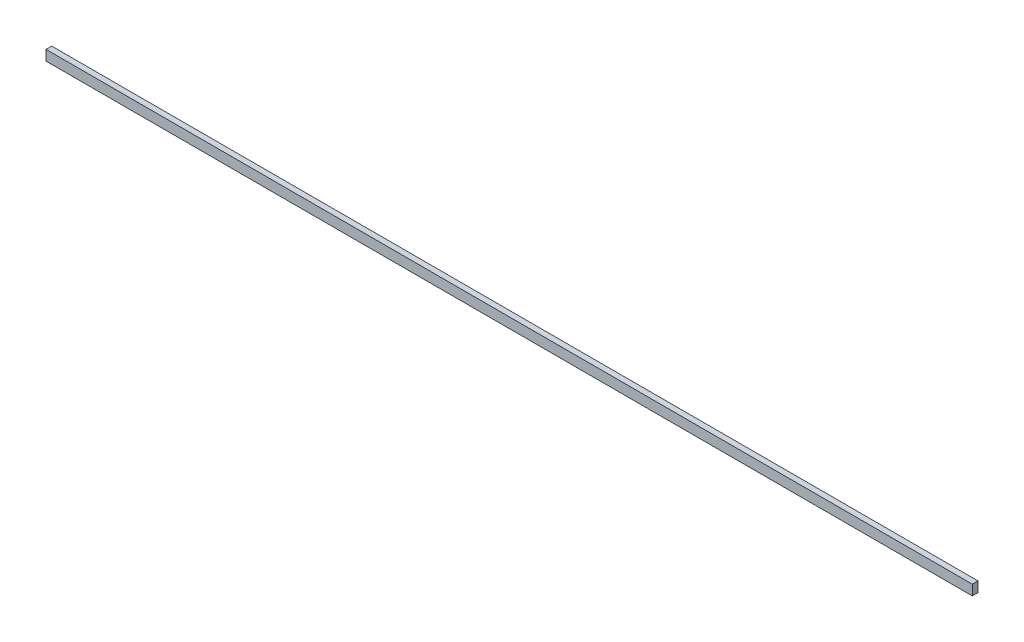
ISO-10303-21;
HEADER;
FILE_DESCRIPTION(('STEP AP214'),'2;1');
FILE_NAME('part.step','',(''),(''),'','','');
FILE_SCHEMA(('AUTOMOTIVE_DESIGN { 1 0 10303 214 1 1 1 1 }'));
ENDSEC;
DATA;
#1=APPLICATION_CONTEXT('core data for automotive mechanical design processes');
#2=APPLICATION_PROTOCOL_DEFINITION('international standard','automotive_design',2000,#1);
#3=PRODUCT_CONTEXT('',#1,'mechanical');
#4=PRODUCT('Part','Part','',(#3));
#5=PRODUCT_RELATED_PRODUCT_CATEGORY('part','',(#4));
#6=PRODUCT_DEFINITION_FORMATION('','',#4);
#7=PRODUCT_DEFINITION_CONTEXT('part definition',#1,'design');
#8=PRODUCT_DEFINITION('design','',#6,#7);
#9=PRODUCT_DEFINITION_SHAPE('','',#8);
#10=(LENGTH_UNIT() NAMED_UNIT(*) SI_UNIT(.MILLI.,.METRE.));
#11=(NAMED_UNIT(*) PLANE_ANGLE_UNIT() SI_UNIT($,.RADIAN.));
#12=(NAMED_UNIT(*) SI_UNIT($,.STERADIAN.) SOLID_ANGLE_UNIT());
#13=UNCERTAINTY_MEASURE_WITH_UNIT(LENGTH_MEASURE(1.E-05),#10,'distance_accuracy_value','');
#14=(GEOMETRIC_REPRESENTATION_CONTEXT(3) GLOBAL_UNCERTAINTY_ASSIGNED_CONTEXT((#13)) GLOBAL_UNIT_ASSIGNED_CONTEXT((#10,
#11,#12)) REPRESENTATION_CONTEXT('',''));
#15=CARTESIAN_POINT('',(0.,0.,0.));
#16=DIRECTION('',(0.,0.,1.));
#17=DIRECTION('',(1.,0.,0.));
#18=AXIS2_PLACEMENT_3D('',#15,#16,#17);
#19=CARTESIAN_POINT('',(227.8,-2.50000000000008,1.4));
#20=DIRECTION('',(-1.,0.,0.));
#21=DIRECTION('',(0.,0.,1.));
#22=AXIS2_PLACEMENT_3D('',#19,#20,#21);
#23=PLANE('',#22);
#24=DIRECTION('',(0.,1.,0.));
#25=VECTOR('',#24,1.);
#26=CARTESIAN_POINT('',(227.8,-2.50000000000008,-1.4));
#27=LINE('',#26,#25);
#28=CARTESIAN_POINT('',(227.8,-2.50000000000008,-1.4));
#29=VERTEX_POINT('',#28);
#30=CARTESIAN_POINT('',(227.8,2.50000000000008,-1.4));
#31=VERTEX_POINT('',#30);
#32=EDGE_CURVE('E96',#29,#31,#27,.T.);
#33=ORIENTED_EDGE('',*,*,#32,.T.);
#34=DIRECTION('',(0.,0.,-1.));
#35=VECTOR('',#34,1.);
#36=CARTESIAN_POINT('',(227.8,2.50000000000008,1.4));
#37=LINE('',#36,#35);
#38=CARTESIAN_POINT('',(227.8,2.50000000000008,1.4));
#39=VERTEX_POINT('',#38);
#40=EDGE_CURVE('E11',#39,#31,#37,.T.);
#41=ORIENTED_EDGE('',*,*,#40,.F.);
#42=DIRECTION('',(0.,1.,0.));
#43=VECTOR('',#42,1.);
#44=CARTESIAN_POINT('',(227.8,-2.50000000000008,1.4));
#45=LINE('',#44,#43);
#46=CARTESIAN_POINT('',(227.8,-2.50000000000008,1.4));
#47=VERTEX_POINT('',#46);
#48=EDGE_CURVE('E84',#47,#39,#45,.T.);
#49=ORIENTED_EDGE('',*,*,#48,.F.);
#50=DIRECTION('',(0.,0.,-1.));
#51=VECTOR('',#50,1.);
#52=CARTESIAN_POINT('',(227.8,-2.50000000000008,1.4));
#53=LINE('',#52,#51);
#54=EDGE_CURVE('E92',#47,#29,#53,.T.);
#55=ORIENTED_EDGE('',*,*,#54,.T.);
#56=EDGE_LOOP('',(#33,#41,#49,#55));
#57=FACE_BOUND('',#56,.T.);
#58=ADVANCED_FACE('F33',(#57),#23,.F.);
#59=CARTESIAN_POINT('',(-227.8,2.49999999999992,1.4));
#60=DIRECTION('',(0.,-1.,0.));
#61=DIRECTION('',(1.,0.,0.));
#62=AXIS2_PLACEMENT_3D('',#59,#60,#61);
#63=PLANE('',#62);
#64=DIRECTION('',(-1.,0.,0.));
#65=VECTOR('',#64,1.);
#66=CARTESIAN_POINT('',(-227.8,2.49999999999992,-1.4));
#67=LINE('',#66,#65);
#68=CARTESIAN_POINT('',(-227.8,2.49999999999992,-1.4));
#69=VERTEX_POINT('',#68);
#70=EDGE_CURVE('E88',#31,#69,#67,.T.);
#71=ORIENTED_EDGE('',*,*,#70,.T.);
#72=DIRECTION('',(0.,0.,-1.));
#73=VECTOR('',#72,1.);
#74=CARTESIAN_POINT('',(-227.8,2.49999999999992,1.4));
#75=LINE('',#74,#73);
#76=CARTESIAN_POINT('',(-227.8,2.49999999999992,1.4));
#77=VERTEX_POINT('',#76);
#78=EDGE_CURVE('E41',#77,#69,#75,.T.);
#79=ORIENTED_EDGE('',*,*,#78,.F.);
#80=DIRECTION('',(-1.,0.,0.));
#81=VECTOR('',#80,1.);
#82=CARTESIAN_POINT('',(-227.8,2.49999999999992,1.4));
#83=LINE('',#82,#81);
#84=EDGE_CURVE('E79',#39,#77,#83,.T.);
#85=ORIENTED_EDGE('',*,*,#84,.F.);
#86=ORIENTED_EDGE('',*,*,#40,.T.);
#87=EDGE_LOOP('',(#71,#79,#85,#86));
#88=FACE_BOUND('',#87,.T.);
#89=ADVANCED_FACE('F87',(#88),#63,.F.);
#90=CARTESIAN_POINT('',(-227.8,-2.50000000000008,1.4));
#91=DIRECTION('',(1.,0.,0.));
#92=DIRECTION('',(0.,0.,-1.));
#93=AXIS2_PLACEMENT_3D('',#90,#91,#92);
#94=PLANE('',#93);
#95=DIRECTION('',(0.,-1.,0.));
#96=VECTOR('',#95,1.);
#97=CARTESIAN_POINT('',(-227.8,-2.50000000000008,-1.4));
#98=LINE('',#97,#96);
#99=CARTESIAN_POINT('',(-227.8,-2.50000000000008,-1.4));
#100=VERTEX_POINT('',#99);
#101=EDGE_CURVE('E66',#69,#100,#98,.T.);
#102=ORIENTED_EDGE('',*,*,#101,.T.);
#103=DIRECTION('',(0.,0.,-1.));
#104=VECTOR('',#103,1.);
#105=CARTESIAN_POINT('',(-227.8,-2.50000000000008,1.4));
#106=LINE('',#105,#104);
#107=CARTESIAN_POINT('',(-227.8,-2.50000000000008,1.4));
#108=VERTEX_POINT('',#107);
#109=EDGE_CURVE('E89',#108,#100,#106,.T.);
#110=ORIENTED_EDGE('',*,*,#109,.F.);
#111=DIRECTION('',(0.,-1.,0.));
#112=VECTOR('',#111,1.);
#113=CARTESIAN_POINT('',(-227.8,-2.50000000000008,1.4));
#114=LINE('',#113,#112);
#115=EDGE_CURVE('E82',#77,#108,#114,.T.);
#116=ORIENTED_EDGE('',*,*,#115,.F.);
#117=ORIENTED_EDGE('',*,*,#78,.T.);
#118=EDGE_LOOP('',(#102,#110,#116,#117));
#119=FACE_BOUND('',#118,.T.);
#120=ADVANCED_FACE('F90',(#119),#94,.F.);
#121=CARTESIAN_POINT('',(-227.8,-2.50000000000008,1.4));
#122=DIRECTION('',(0.,1.,0.));
#123=DIRECTION('',(0.,0.,1.));
#124=AXIS2_PLACEMENT_3D('',#121,#122,#123);
#125=PLANE('',#124);
#126=DIRECTION('',(1.,0.,0.));
#127=VECTOR('',#126,1.);
#128=CARTESIAN_POINT('',(-227.8,-2.50000000000008,-1.4));
#129=LINE('',#128,#127);
#130=EDGE_CURVE('E72',#100,#29,#129,.T.);
#131=ORIENTED_EDGE('',*,*,#130,.T.);
#132=ORIENTED_EDGE('',*,*,#54,.F.);
#133=DIRECTION('',(1.,0.,0.));
#134=VECTOR('',#133,1.);
#135=CARTESIAN_POINT('',(-227.8,-2.50000000000008,1.4));
#136=LINE('',#135,#134);
#137=EDGE_CURVE('E49',#108,#47,#136,.T.);
#138=ORIENTED_EDGE('',*,*,#137,.F.);
#139=ORIENTED_EDGE('',*,*,#109,.T.);
#140=EDGE_LOOP('',(#131,#132,#138,#139));
#141=FACE_BOUND('',#140,.T.);
#142=ADVANCED_FACE('F103',(#141),#125,.F.);
#143=CARTESIAN_POINT('',(0.,0.,1.4));
#144=DIRECTION('',(0.,0.,-1.));
#145=DIRECTION('',(-1.,0.,0.));
#146=AXIS2_PLACEMENT_3D('',#143,#144,#145);
#147=PLANE('',#146);
#148=ORIENTED_EDGE('',*,*,#48,.T.);
#149=ORIENTED_EDGE('',*,*,#84,.T.);
#150=ORIENTED_EDGE('',*,*,#115,.T.);
#151=ORIENTED_EDGE('',*,*,#137,.T.);
#152=EDGE_LOOP('',(#148,#149,#150,#151));
#153=FACE_BOUND('',#152,.T.);
#154=ADVANCED_FACE('F80',(#153),#147,.F.);
#155=CARTESIAN_POINT('',(0.,0.,-1.4));
#156=DIRECTION('',(0.,0.,-1.));
#157=DIRECTION('',(-1.,0.,0.));
#158=AXIS2_PLACEMENT_3D('',#155,#156,#157);
#159=PLANE('',#158);
#160=ORIENTED_EDGE('',*,*,#32,.F.);
#161=ORIENTED_EDGE('',*,*,#130,.F.);
#162=ORIENTED_EDGE('',*,*,#101,.F.);
#163=ORIENTED_EDGE('',*,*,#70,.F.);
#164=EDGE_LOOP('',(#160,#161,#162,#163));
#165=FACE_BOUND('',#164,.T.);
#166=ADVANCED_FACE('F106',(#165),#159,.T.);
#167=CLOSED_SHELL('',(#58,#89,#120,#142,#154,#166));
#168=MANIFOLD_SOLID_BREP('B2',#167);
#169=ADVANCED_BREP_SHAPE_REPRESENTATION('',(#18,#168),#14);
#170=SHAPE_DEFINITION_REPRESENTATION(#9,#169);
ENDSEC;
END-ISO-10303-21;
